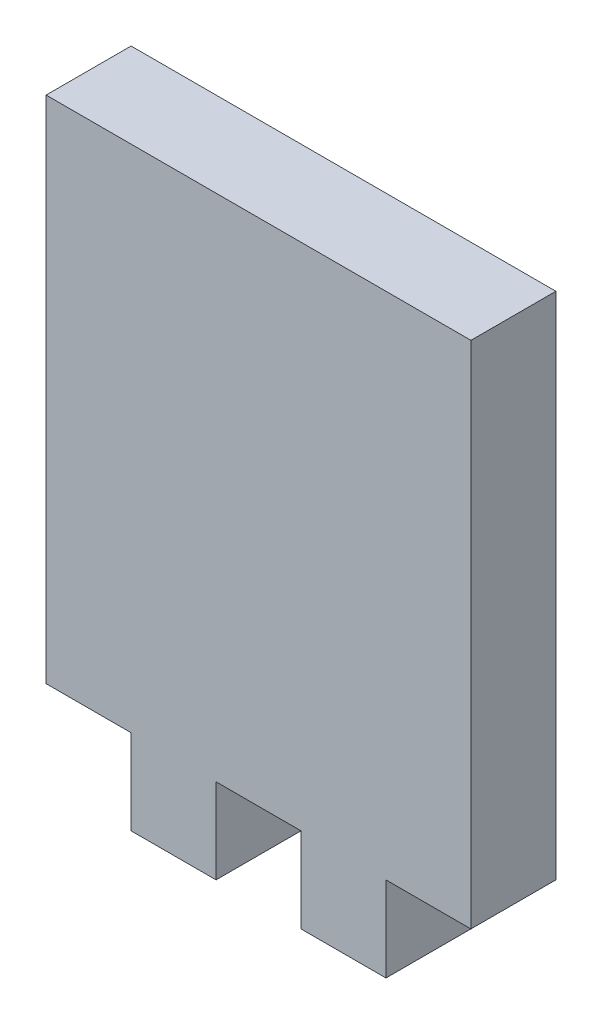
ISO-10303-21;
HEADER;
FILE_DESCRIPTION(('STEP AP214'),'2;1');
FILE_NAME('part.step','',(''),(''),'','','');
FILE_SCHEMA(('AUTOMOTIVE_DESIGN { 1 0 10303 214 1 1 1 1 }'));
ENDSEC;
DATA;
#1=APPLICATION_CONTEXT('core data for automotive mechanical design processes');
#2=APPLICATION_PROTOCOL_DEFINITION('international standard','automotive_design',2000,#1);
#3=PRODUCT_CONTEXT('',#1,'mechanical');
#4=PRODUCT('Part','Part','',(#3));
#5=PRODUCT_RELATED_PRODUCT_CATEGORY('part','',(#4));
#6=PRODUCT_DEFINITION_FORMATION('','',#4);
#7=PRODUCT_DEFINITION_CONTEXT('part definition',#1,'design');
#8=PRODUCT_DEFINITION('design','',#6,#7);
#9=PRODUCT_DEFINITION_SHAPE('','',#8);
#10=(LENGTH_UNIT() NAMED_UNIT(*) SI_UNIT(.MILLI.,.METRE.));
#11=(NAMED_UNIT(*) PLANE_ANGLE_UNIT() SI_UNIT($,.RADIAN.));
#12=(NAMED_UNIT(*) SI_UNIT($,.STERADIAN.) SOLID_ANGLE_UNIT());
#13=UNCERTAINTY_MEASURE_WITH_UNIT(LENGTH_MEASURE(1.E-05),#10,'distance_accuracy_value','');
#14=(GEOMETRIC_REPRESENTATION_CONTEXT(3) GLOBAL_UNCERTAINTY_ASSIGNED_CONTEXT((#13)) GLOBAL_UNIT_ASSIGNED_CONTEXT((#10,
#11,#12)) REPRESENTATION_CONTEXT('',''));
#15=CARTESIAN_POINT('',(0.,0.,0.));
#16=DIRECTION('',(0.,0.,1.));
#17=DIRECTION('',(1.,0.,0.));
#18=AXIS2_PLACEMENT_3D('',#15,#16,#17);
#19=CARTESIAN_POINT('',(-50.0134005529535,4.11004075867885,5.));
#20=DIRECTION('',(1.,0.,0.));
#21=DIRECTION('',(0.,0.,-1.));
#22=AXIS2_PLACEMENT_3D('',#19,#20,#21);
#23=PLANE('',#22);
#24=DIRECTION('',(0.,-1.,0.));
#25=VECTOR('',#24,1.);
#26=CARTESIAN_POINT('',(-50.0134005529535,4.11004075867885,0.));
#27=LINE('',#26,#25);
#28=CARTESIAN_POINT('',(-50.0134005529535,34.1100407586788,0.));
#29=VERTEX_POINT('',#28);
#30=CARTESIAN_POINT('',(-50.0134005529535,4.11004075867885,0.));
#31=VERTEX_POINT('',#30);
#32=EDGE_CURVE('E153',#29,#31,#27,.T.);
#33=ORIENTED_EDGE('',*,*,#32,.T.);
#34=DIRECTION('',(0.,0.,-1.));
#35=VECTOR('',#34,1.);
#36=CARTESIAN_POINT('',(-50.0134005529535,4.11004075867885,5.));
#37=LINE('',#36,#35);
#38=CARTESIAN_POINT('',(-50.0134005529535,4.11004075867885,5.));
#39=VERTEX_POINT('',#38);
#40=EDGE_CURVE('E11',#39,#31,#37,.T.);
#41=ORIENTED_EDGE('',*,*,#40,.F.);
#42=DIRECTION('',(0.,-1.,0.));
#43=VECTOR('',#42,1.);
#44=CARTESIAN_POINT('',(-50.0134005529535,4.11004075867885,5.));
#45=LINE('',#44,#43);
#46=CARTESIAN_POINT('',(-50.0134005529535,34.1100407586788,5.));
#47=VERTEX_POINT('',#46);
#48=EDGE_CURVE('E175',#47,#39,#45,.T.);
#49=ORIENTED_EDGE('',*,*,#48,.F.);
#50=DIRECTION('',(0.,0.,-1.));
#51=VECTOR('',#50,1.);
#52=CARTESIAN_POINT('',(-50.0134005529535,34.1100407586788,5.));
#53=LINE('',#52,#51);
#54=EDGE_CURVE('E149',#47,#29,#53,.T.);
#55=ORIENTED_EDGE('',*,*,#54,.T.);
#56=EDGE_LOOP('',(#33,#41,#49,#55));
#57=FACE_BOUND('',#56,.T.);
#58=ADVANCED_FACE('F33',(#57),#23,.F.);
#59=CARTESIAN_POINT('',(-50.0134005529535,4.11004075867885,5.));
#60=DIRECTION('',(0.,1.,0.));
#61=DIRECTION('',(0.,0.,1.));
#62=AXIS2_PLACEMENT_3D('',#59,#60,#61);
#63=PLANE('',#62);
#64=DIRECTION('',(1.,0.,0.));
#65=VECTOR('',#64,1.);
#66=CARTESIAN_POINT('',(-50.0134005529535,4.11004075867885,0.));
#67=LINE('',#66,#65);
#68=CARTESIAN_POINT('',(-45.0134005529535,4.11004075867885,0.));
#69=VERTEX_POINT('',#68);
#70=EDGE_CURVE('E156',#31,#69,#67,.T.);
#71=ORIENTED_EDGE('',*,*,#70,.T.);
#72=DIRECTION('',(0.,0.,-1.));
#73=VECTOR('',#72,1.);
#74=CARTESIAN_POINT('',(-45.0134005529535,4.11004075867885,5.));
#75=LINE('',#74,#73);
#76=CARTESIAN_POINT('',(-45.0134005529535,4.11004075867885,5.));
#77=VERTEX_POINT('',#76);
#78=EDGE_CURVE('E41',#77,#69,#75,.T.);
#79=ORIENTED_EDGE('',*,*,#78,.F.);
#80=DIRECTION('',(1.,0.,0.));
#81=VECTOR('',#80,1.);
#82=CARTESIAN_POINT('',(-50.0134005529535,4.11004075867885,5.));
#83=LINE('',#82,#81);
#84=EDGE_CURVE('E104',#39,#77,#83,.T.);
#85=ORIENTED_EDGE('',*,*,#84,.F.);
#86=ORIENTED_EDGE('',*,*,#40,.T.);
#87=EDGE_LOOP('',(#71,#79,#85,#86));
#88=FACE_BOUND('',#87,.T.);
#89=ADVANCED_FACE('F253',(#88),#63,.F.);
#90=CARTESIAN_POINT('',(-45.0134005529535,4.11004075867885,5.));
#91=DIRECTION('',(1.,0.,0.));
#92=DIRECTION('',(0.,0.,-1.));
#93=AXIS2_PLACEMENT_3D('',#90,#91,#92);
#94=PLANE('',#93);
#95=DIRECTION('',(0.,-1.,0.));
#96=VECTOR('',#95,1.);
#97=CARTESIAN_POINT('',(-45.0134005529535,4.11004075867885,0.));
#98=LINE('',#97,#96);
#99=CARTESIAN_POINT('',(-45.0134005529535,-0.889959241321139,0.));
#100=VERTEX_POINT('',#99);
#101=EDGE_CURVE('E158',#69,#100,#98,.T.);
#102=ORIENTED_EDGE('',*,*,#101,.T.);
#103=DIRECTION('',(0.,0.,-1.));
#104=VECTOR('',#103,1.);
#105=CARTESIAN_POINT('',(-45.0134005529535,-0.889959241321139,5.));
#106=LINE('',#105,#104);
#107=CARTESIAN_POINT('',(-45.0134005529535,-0.889959241321139,5.));
#108=VERTEX_POINT('',#107);
#109=EDGE_CURVE('E194',#108,#100,#106,.T.);
#110=ORIENTED_EDGE('',*,*,#109,.F.);
#111=DIRECTION('',(0.,-1.,0.));
#112=VECTOR('',#111,1.);
#113=CARTESIAN_POINT('',(-45.0134005529535,4.11004075867885,5.));
#114=LINE('',#113,#112);
#115=EDGE_CURVE('E202',#77,#108,#114,.T.);
#116=ORIENTED_EDGE('',*,*,#115,.F.);
#117=ORIENTED_EDGE('',*,*,#78,.T.);
#118=EDGE_LOOP('',(#102,#110,#116,#117));
#119=FACE_BOUND('',#118,.T.);
#120=ADVANCED_FACE('F200',(#119),#94,.F.);
#121=CARTESIAN_POINT('',(-45.0134005529535,-0.889959241321139,5.));
#122=DIRECTION('',(0.,1.,0.));
#123=DIRECTION('',(0.,0.,1.));
#124=AXIS2_PLACEMENT_3D('',#121,#122,#123);
#125=PLANE('',#124);
#126=DIRECTION('',(1.,0.,0.));
#127=VECTOR('',#126,1.);
#128=CARTESIAN_POINT('',(-45.0134005529535,-0.889959241321139,0.));
#129=LINE('',#128,#127);
#130=CARTESIAN_POINT('',(-40.0134005529535,-0.889959241321139,0.));
#131=VERTEX_POINT('',#130);
#132=EDGE_CURVE('E160',#100,#131,#129,.T.);
#133=ORIENTED_EDGE('',*,*,#132,.T.);
#134=DIRECTION('',(0.,0.,-1.));
#135=VECTOR('',#134,1.);
#136=CARTESIAN_POINT('',(-40.0134005529535,-0.889959241321139,5.));
#137=LINE('',#136,#135);
#138=CARTESIAN_POINT('',(-40.0134005529535,-0.889959241321139,5.));
#139=VERTEX_POINT('',#138);
#140=EDGE_CURVE('E191',#139,#131,#137,.T.);
#141=ORIENTED_EDGE('',*,*,#140,.F.);
#142=DIRECTION('',(1.,0.,0.));
#143=VECTOR('',#142,1.);
#144=CARTESIAN_POINT('',(-45.0134005529535,-0.889959241321139,5.));
#145=LINE('',#144,#143);
#146=EDGE_CURVE('E220',#108,#139,#145,.T.);
#147=ORIENTED_EDGE('',*,*,#146,.F.);
#148=ORIENTED_EDGE('',*,*,#109,.T.);
#149=EDGE_LOOP('',(#133,#141,#147,#148));
#150=FACE_BOUND('',#149,.T.);
#151=ADVANCED_FACE('F211',(#150),#125,.F.);
#152=CARTESIAN_POINT('',(-40.0134005529535,-0.889959241321139,5.));
#153=DIRECTION('',(-1.,0.,0.));
#154=DIRECTION('',(0.,0.,1.));
#155=AXIS2_PLACEMENT_3D('',#152,#153,#154);
#156=PLANE('',#155);
#157=DIRECTION('',(0.,1.,0.));
#158=VECTOR('',#157,1.);
#159=CARTESIAN_POINT('',(-40.0134005529535,-0.889959241321139,0.));
#160=LINE('',#159,#158);
#161=CARTESIAN_POINT('',(-40.0134005529535,4.11004075867885,0.));
#162=VERTEX_POINT('',#161);
#163=EDGE_CURVE('E162',#131,#162,#160,.T.);
#164=ORIENTED_EDGE('',*,*,#163,.T.);
#165=DIRECTION('',(0.,0.,-1.));
#166=VECTOR('',#165,1.);
#167=CARTESIAN_POINT('',(-40.0134005529535,4.11004075867885,5.));
#168=LINE('',#167,#166);
#169=CARTESIAN_POINT('',(-40.0134005529535,4.11004075867885,5.));
#170=VERTEX_POINT('',#169);
#171=EDGE_CURVE('E188',#170,#162,#168,.T.);
#172=ORIENTED_EDGE('',*,*,#171,.F.);
#173=DIRECTION('',(0.,1.,0.));
#174=VECTOR('',#173,1.);
#175=CARTESIAN_POINT('',(-40.0134005529535,-0.889959241321139,5.));
#176=LINE('',#175,#174);
#177=EDGE_CURVE('E217',#139,#170,#176,.T.);
#178=ORIENTED_EDGE('',*,*,#177,.F.);
#179=ORIENTED_EDGE('',*,*,#140,.T.);
#180=EDGE_LOOP('',(#164,#172,#178,#179));
#181=FACE_BOUND('',#180,.T.);
#182=ADVANCED_FACE('F215',(#181),#156,.F.);
#183=CARTESIAN_POINT('',(-40.0134005529535,4.11004075867885,5.));
#184=DIRECTION('',(0.,1.,0.));
#185=DIRECTION('',(0.,0.,1.));
#186=AXIS2_PLACEMENT_3D('',#183,#184,#185);
#187=PLANE('',#186);
#188=DIRECTION('',(1.,0.,0.));
#189=VECTOR('',#188,1.);
#190=CARTESIAN_POINT('',(-40.0134005529535,4.11004075867885,0.));
#191=LINE('',#190,#189);
#192=CARTESIAN_POINT('',(-35.0134005529535,4.11004075867885,0.));
#193=VERTEX_POINT('',#192);
#194=EDGE_CURVE('E164',#162,#193,#191,.T.);
#195=ORIENTED_EDGE('',*,*,#194,.T.);
#196=DIRECTION('',(0.,0.,-1.));
#197=VECTOR('',#196,1.);
#198=CARTESIAN_POINT('',(-35.0134005529535,4.11004075867885,5.));
#199=LINE('',#198,#197);
#200=CARTESIAN_POINT('',(-35.0134005529535,4.11004075867885,5.));
#201=VERTEX_POINT('',#200);
#202=EDGE_CURVE('E185',#201,#193,#199,.T.);
#203=ORIENTED_EDGE('',*,*,#202,.F.);
#204=DIRECTION('',(1.,0.,0.));
#205=VECTOR('',#204,1.);
#206=CARTESIAN_POINT('',(-40.0134005529535,4.11004075867885,5.));
#207=LINE('',#206,#205);
#208=EDGE_CURVE('E219',#170,#201,#207,.T.);
#209=ORIENTED_EDGE('',*,*,#208,.F.);
#210=ORIENTED_EDGE('',*,*,#171,.T.);
#211=EDGE_LOOP('',(#195,#203,#209,#210));
#212=FACE_BOUND('',#211,.T.);
#213=ADVANCED_FACE('F266',(#212),#187,.F.);
#214=CARTESIAN_POINT('',(-35.0134005529535,4.11004075867885,5.));
#215=DIRECTION('',(1.,0.,0.));
#216=DIRECTION('',(0.,1.,0.));
#217=AXIS2_PLACEMENT_3D('',#214,#215,#216);
#218=PLANE('',#217);
#219=DIRECTION('',(0.,-1.,0.));
#220=VECTOR('',#219,1.);
#221=CARTESIAN_POINT('',(-35.0134005529535,4.11004075867885,0.));
#222=LINE('',#221,#220);
#223=CARTESIAN_POINT('',(-35.0134005529535,-0.889959241321139,0.));
#224=VERTEX_POINT('',#223);
#225=EDGE_CURVE('E166',#193,#224,#222,.T.);
#226=ORIENTED_EDGE('',*,*,#225,.T.);
#227=DIRECTION('',(0.,0.,-1.));
#228=VECTOR('',#227,1.);
#229=CARTESIAN_POINT('',(-35.0134005529535,-0.889959241321139,5.));
#230=LINE('',#229,#228);
#231=CARTESIAN_POINT('',(-35.0134005529535,-0.889959241321139,5.));
#232=VERTEX_POINT('',#231);
#233=EDGE_CURVE('E182',#232,#224,#230,.T.);
#234=ORIENTED_EDGE('',*,*,#233,.F.);
#235=DIRECTION('',(0.,-1.,0.));
#236=VECTOR('',#235,1.);
#237=CARTESIAN_POINT('',(-35.0134005529535,4.11004075867885,5.));
#238=LINE('',#237,#236);
#239=EDGE_CURVE('E222',#201,#232,#238,.T.);
#240=ORIENTED_EDGE('',*,*,#239,.F.);
#241=ORIENTED_EDGE('',*,*,#202,.T.);
#242=EDGE_LOOP('',(#226,#234,#240,#241));
#243=FACE_BOUND('',#242,.T.);
#244=ADVANCED_FACE('F269',(#243),#218,.F.);
#245=CARTESIAN_POINT('',(-35.0134005529535,-0.889959241321139,5.));
#246=DIRECTION('',(0.,1.,0.));
#247=DIRECTION('',(0.,0.,1.));
#248=AXIS2_PLACEMENT_3D('',#245,#246,#247);
#249=PLANE('',#248);
#250=DIRECTION('',(1.,0.,0.));
#251=VECTOR('',#250,1.);
#252=CARTESIAN_POINT('',(-35.0134005529535,-0.889959241321139,0.));
#253=LINE('',#252,#251);
#254=CARTESIAN_POINT('',(-30.0134005529535,-0.889959241321139,0.));
#255=VERTEX_POINT('',#254);
#256=EDGE_CURVE('E168',#224,#255,#253,.T.);
#257=ORIENTED_EDGE('',*,*,#256,.T.);
#258=DIRECTION('',(0.,0.,-1.));
#259=VECTOR('',#258,1.);
#260=CARTESIAN_POINT('',(-30.0134005529535,-0.889959241321139,5.));
#261=LINE('',#260,#259);
#262=CARTESIAN_POINT('',(-30.0134005529535,-0.889959241321139,5.));
#263=VERTEX_POINT('',#262);
#264=EDGE_CURVE('E179',#263,#255,#261,.T.);
#265=ORIENTED_EDGE('',*,*,#264,.F.);
#266=DIRECTION('',(1.,0.,0.));
#267=VECTOR('',#266,1.);
#268=CARTESIAN_POINT('',(-35.0134005529535,-0.889959241321139,5.));
#269=LINE('',#268,#267);
#270=EDGE_CURVE('E228',#232,#263,#269,.T.);
#271=ORIENTED_EDGE('',*,*,#270,.F.);
#272=ORIENTED_EDGE('',*,*,#233,.T.);
#273=EDGE_LOOP('',(#257,#265,#271,#272));
#274=FACE_BOUND('',#273,.T.);
#275=ADVANCED_FACE('F234',(#274),#249,.F.);
#276=CARTESIAN_POINT('',(-30.0134005529535,-0.889959241321139,5.));
#277=DIRECTION('',(-1.,0.,0.));
#278=DIRECTION('',(0.,0.,1.));
#279=AXIS2_PLACEMENT_3D('',#276,#277,#278);
#280=PLANE('',#279);
#281=DIRECTION('',(0.,1.,0.));
#282=VECTOR('',#281,1.);
#283=CARTESIAN_POINT('',(-30.0134005529535,-0.889959241321139,0.));
#284=LINE('',#283,#282);
#285=CARTESIAN_POINT('',(-30.0134005529535,4.11004075867885,0.));
#286=VERTEX_POINT('',#285);
#287=EDGE_CURVE('E170',#255,#286,#284,.T.);
#288=ORIENTED_EDGE('',*,*,#287,.T.);
#289=DIRECTION('',(0.,0.,-1.));
#290=VECTOR('',#289,1.);
#291=CARTESIAN_POINT('',(-30.0134005529535,4.11004075867885,5.));
#292=LINE('',#291,#290);
#293=CARTESIAN_POINT('',(-30.0134005529535,4.11004075867885,5.));
#294=VERTEX_POINT('',#293);
#295=EDGE_CURVE('E144',#294,#286,#292,.T.);
#296=ORIENTED_EDGE('',*,*,#295,.F.);
#297=DIRECTION('',(0.,1.,0.));
#298=VECTOR('',#297,1.);
#299=CARTESIAN_POINT('',(-30.0134005529535,-0.889959241321139,5.));
#300=LINE('',#299,#298);
#301=EDGE_CURVE('E135',#263,#294,#300,.T.);
#302=ORIENTED_EDGE('',*,*,#301,.F.);
#303=ORIENTED_EDGE('',*,*,#264,.T.);
#304=EDGE_LOOP('',(#288,#296,#302,#303));
#305=FACE_BOUND('',#304,.T.);
#306=ADVANCED_FACE('F238',(#305),#280,.F.);
#307=CARTESIAN_POINT('',(-30.0134005529535,4.11004075867885,5.));
#308=DIRECTION('',(0.,1.,0.));
#309=DIRECTION('',(0.,0.,1.));
#310=AXIS2_PLACEMENT_3D('',#307,#308,#309);
#311=PLANE('',#310);
#312=DIRECTION('',(1.,0.,0.));
#313=VECTOR('',#312,1.);
#314=CARTESIAN_POINT('',(-30.0134005529535,4.11004075867885,0.));
#315=LINE('',#314,#313);
#316=CARTESIAN_POINT('',(-25.0134005529535,4.11004075867885,0.));
#317=VERTEX_POINT('',#316);
#318=EDGE_CURVE('E143',#286,#317,#315,.T.);
#319=ORIENTED_EDGE('',*,*,#318,.T.);
#320=DIRECTION('',(0.,0.,-1.));
#321=VECTOR('',#320,1.);
#322=CARTESIAN_POINT('',(-25.0134005529535,4.11004075867885,5.));
#323=LINE('',#322,#321);
#324=CARTESIAN_POINT('',(-25.0134005529535,4.11004075867885,5.));
#325=VERTEX_POINT('',#324);
#326=EDGE_CURVE('E140',#325,#317,#323,.T.);
#327=ORIENTED_EDGE('',*,*,#326,.F.);
#328=DIRECTION('',(1.,0.,0.));
#329=VECTOR('',#328,1.);
#330=CARTESIAN_POINT('',(-30.0134005529535,4.11004075867885,5.));
#331=LINE('',#330,#329);
#332=EDGE_CURVE('E129',#294,#325,#331,.T.);
#333=ORIENTED_EDGE('',*,*,#332,.F.);
#334=ORIENTED_EDGE('',*,*,#295,.T.);
#335=EDGE_LOOP('',(#319,#327,#333,#334));
#336=FACE_BOUND('',#335,.T.);
#337=ADVANCED_FACE('F141',(#336),#311,.F.);
#338=CARTESIAN_POINT('',(-25.0134005529535,4.11004075867885,5.));
#339=DIRECTION('',(-1.,0.,0.));
#340=DIRECTION('',(0.,-1.,0.));
#341=AXIS2_PLACEMENT_3D('',#338,#339,#340);
#342=PLANE('',#341);
#343=DIRECTION('',(0.,1.,0.));
#344=VECTOR('',#343,1.);
#345=CARTESIAN_POINT('',(-25.0134005529535,4.11004075867885,0.));
#346=LINE('',#345,#344);
#347=CARTESIAN_POINT('',(-25.0134005529536,34.1100407586788,0.));
#348=VERTEX_POINT('',#347);
#349=EDGE_CURVE('E90',#317,#348,#346,.T.);
#350=ORIENTED_EDGE('',*,*,#349,.T.);
#351=DIRECTION('',(0.,0.,-1.));
#352=VECTOR('',#351,1.);
#353=CARTESIAN_POINT('',(-25.0134005529536,34.1100407586788,5.));
#354=LINE('',#353,#352);
#355=CARTESIAN_POINT('',(-25.0134005529536,34.1100407586788,5.));
#356=VERTEX_POINT('',#355);
#357=EDGE_CURVE('E145',#356,#348,#354,.T.);
#358=ORIENTED_EDGE('',*,*,#357,.F.);
#359=DIRECTION('',(0.,1.,0.));
#360=VECTOR('',#359,1.);
#361=CARTESIAN_POINT('',(-25.0134005529535,4.11004075867885,5.));
#362=LINE('',#361,#360);
#363=EDGE_CURVE('E133',#325,#356,#362,.T.);
#364=ORIENTED_EDGE('',*,*,#363,.F.);
#365=ORIENTED_EDGE('',*,*,#326,.T.);
#366=EDGE_LOOP('',(#350,#358,#364,#365));
#367=FACE_BOUND('',#366,.T.);
#368=ADVANCED_FACE('F147',(#367),#342,.F.);
#369=CARTESIAN_POINT('',(-50.0134005529535,34.1100407586788,5.));
#370=DIRECTION('',(0.,-1.,0.));
#371=DIRECTION('',(0.,0.,-1.));
#372=AXIS2_PLACEMENT_3D('',#369,#370,#371);
#373=PLANE('',#372);
#374=DIRECTION('',(-1.,0.,0.));
#375=VECTOR('',#374,1.);
#376=CARTESIAN_POINT('',(-50.0134005529535,34.1100407586788,0.));
#377=LINE('',#376,#375);
#378=EDGE_CURVE('E96',#348,#29,#377,.T.);
#379=ORIENTED_EDGE('',*,*,#378,.T.);
#380=ORIENTED_EDGE('',*,*,#54,.F.);
#381=DIRECTION('',(-1.,0.,0.));
#382=VECTOR('',#381,1.);
#383=CARTESIAN_POINT('',(-50.0134005529535,34.1100407586788,5.));
#384=LINE('',#383,#382);
#385=EDGE_CURVE('E49',#356,#47,#384,.T.);
#386=ORIENTED_EDGE('',*,*,#385,.F.);
#387=ORIENTED_EDGE('',*,*,#357,.T.);
#388=EDGE_LOOP('',(#379,#380,#386,#387));
#389=FACE_BOUND('',#388,.T.);
#390=ADVANCED_FACE('F242',(#389),#373,.F.);
#391=CARTESIAN_POINT('',(0.,0.,5.));
#392=DIRECTION('',(0.,0.,-1.));
#393=DIRECTION('',(-1.,0.,0.));
#394=AXIS2_PLACEMENT_3D('',#391,#392,#393);
#395=PLANE('',#394);
#396=ORIENTED_EDGE('',*,*,#48,.T.);
#397=ORIENTED_EDGE('',*,*,#84,.T.);
#398=ORIENTED_EDGE('',*,*,#115,.T.);
#399=ORIENTED_EDGE('',*,*,#146,.T.);
#400=ORIENTED_EDGE('',*,*,#177,.T.);
#401=ORIENTED_EDGE('',*,*,#208,.T.);
#402=ORIENTED_EDGE('',*,*,#239,.T.);
#403=ORIENTED_EDGE('',*,*,#270,.T.);
#404=ORIENTED_EDGE('',*,*,#301,.T.);
#405=ORIENTED_EDGE('',*,*,#332,.T.);
#406=ORIENTED_EDGE('',*,*,#363,.T.);
#407=ORIENTED_EDGE('',*,*,#385,.T.);
#408=EDGE_LOOP('',(#396,#397,#398,#399,#400,#401,#402,#403,#404,#405,#406,#407));
#409=FACE_BOUND('',#408,.T.);
#410=ADVANCED_FACE('F131',(#409),#395,.F.);
#411=CARTESIAN_POINT('',(0.,0.,0.));
#412=DIRECTION('',(0.,0.,-1.));
#413=DIRECTION('',(-1.,0.,0.));
#414=AXIS2_PLACEMENT_3D('',#411,#412,#413);
#415=PLANE('',#414);
#416=ORIENTED_EDGE('',*,*,#32,.F.);
#417=ORIENTED_EDGE('',*,*,#378,.F.);
#418=ORIENTED_EDGE('',*,*,#349,.F.);
#419=ORIENTED_EDGE('',*,*,#318,.F.);
#420=ORIENTED_EDGE('',*,*,#287,.F.);
#421=ORIENTED_EDGE('',*,*,#256,.F.);
#422=ORIENTED_EDGE('',*,*,#225,.F.);
#423=ORIENTED_EDGE('',*,*,#194,.F.);
#424=ORIENTED_EDGE('',*,*,#163,.F.);
#425=ORIENTED_EDGE('',*,*,#132,.F.);
#426=ORIENTED_EDGE('',*,*,#101,.F.);
#427=ORIENTED_EDGE('',*,*,#70,.F.);
#428=EDGE_LOOP('',(#416,#417,#418,#419,#420,#421,#422,#423,#424,#425,#426,#427));
#429=FACE_BOUND('',#428,.T.);
#430=ADVANCED_FACE('F206',(#429),#415,.T.);
#431=CLOSED_SHELL('',(#58,#89,#120,#151,#182,#213,#244,#275,#306,#337,#368,#390,#410,#430));
#432=MANIFOLD_SOLID_BREP('B2',#431);
#433=ADVANCED_BREP_SHAPE_REPRESENTATION('',(#18,#432),#14);
#434=SHAPE_DEFINITION_REPRESENTATION(#9,#433);
ENDSEC;
END-ISO-10303-21;
